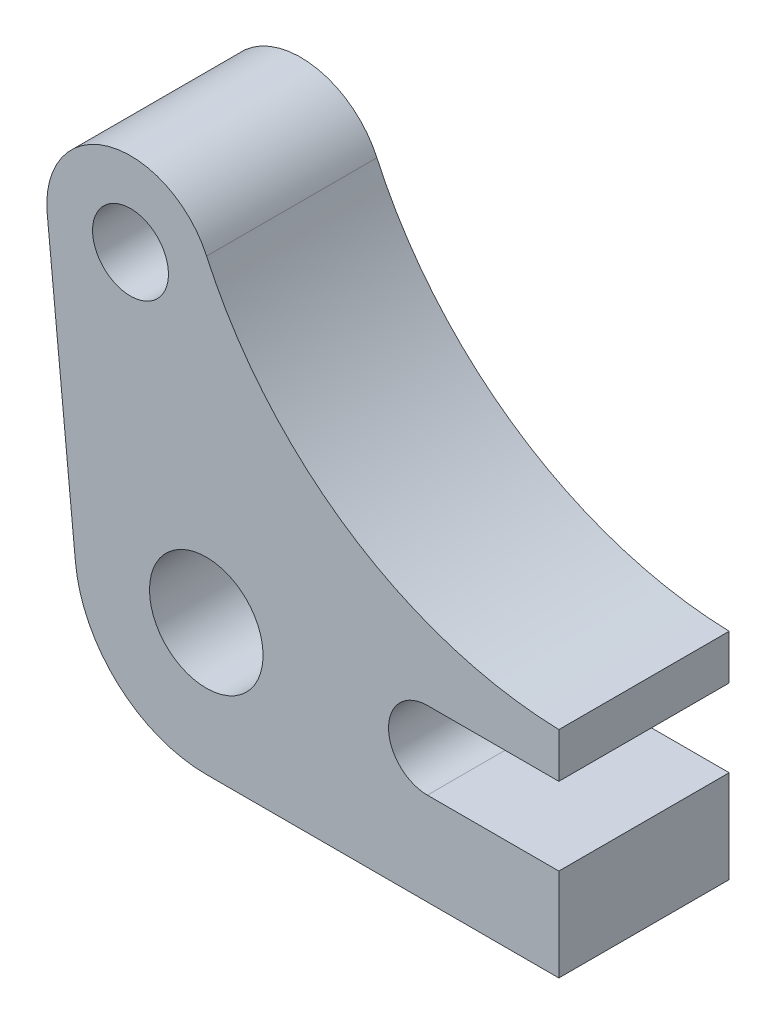
ISO-10303-21;
HEADER;
FILE_DESCRIPTION(('STEP AP214'),'2;1');
FILE_NAME('part.step','',(''),(''),'','','');
FILE_SCHEMA(('AUTOMOTIVE_DESIGN { 1 0 10303 214 1 1 1 1 }'));
ENDSEC;
DATA;
#1=APPLICATION_CONTEXT('core data for automotive mechanical design processes');
#2=APPLICATION_PROTOCOL_DEFINITION('international standard','automotive_design',2000,#1);
#3=PRODUCT_CONTEXT('',#1,'mechanical');
#4=PRODUCT('Part','Part','',(#3));
#5=PRODUCT_RELATED_PRODUCT_CATEGORY('part','',(#4));
#6=PRODUCT_DEFINITION_FORMATION('','',#4);
#7=PRODUCT_DEFINITION_CONTEXT('part definition',#1,'design');
#8=PRODUCT_DEFINITION('design','',#6,#7);
#9=PRODUCT_DEFINITION_SHAPE('','',#8);
#10=(LENGTH_UNIT() NAMED_UNIT(*) SI_UNIT(.MILLI.,.METRE.));
#11=(NAMED_UNIT(*) PLANE_ANGLE_UNIT() SI_UNIT($,.RADIAN.));
#12=(NAMED_UNIT(*) SI_UNIT($,.STERADIAN.) SOLID_ANGLE_UNIT());
#13=UNCERTAINTY_MEASURE_WITH_UNIT(LENGTH_MEASURE(1.E-05),#10,'distance_accuracy_value','');
#14=(GEOMETRIC_REPRESENTATION_CONTEXT(3) GLOBAL_UNCERTAINTY_ASSIGNED_CONTEXT((#13)) GLOBAL_UNIT_ASSIGNED_CONTEXT((#10,
#11,#12)) REPRESENTATION_CONTEXT('',''));
#15=CARTESIAN_POINT('',(0.,0.,0.));
#16=DIRECTION('',(0.,0.,1.));
#17=DIRECTION('',(1.,0.,0.));
#18=AXIS2_PLACEMENT_3D('',#15,#16,#17);
#19=CARTESIAN_POINT('',(-32.1833709770097,-19.5334703523663,28.5));
#20=DIRECTION('',(0.,0.,-1.));
#21=DIRECTION('',(-1.,0.,0.));
#22=AXIS2_PLACEMENT_3D('',#19,#20,#21);
#23=CYLINDRICAL_SURFACE('',#22,22.);
#24=CARTESIAN_POINT('',(-32.1833709770097,-19.5334703523663,0.));
#25=DIRECTION('',(0.,0.,1.));
#26=DIRECTION('',(1.,0.,0.));
#27=AXIS2_PLACEMENT_3D('',#24,#25,#26);
#28=CIRCLE('',#27,22.);
#29=CARTESIAN_POINT('',(-32.1833709770097,-41.5334703523663,0.));
#30=VERTEX_POINT('',#29);
#31=CARTESIAN_POINT('',(-54.0782417455557,-21.6816402778313,0.));
#32=VERTEX_POINT('',#31);
#33=EDGE_CURVE('E163',#30,#32,#28,.F.);
#34=ORIENTED_EDGE('',*,*,#33,.F.);
#35=DIRECTION('',(0.,0.,-1.));
#36=VECTOR('',#35,1.);
#37=CARTESIAN_POINT('',(-32.1833709770097,-41.5334703523663,28.5));
#38=LINE('',#37,#36);
#39=CARTESIAN_POINT('',(-32.1833709770097,-41.5334703523663,28.5));
#40=VERTEX_POINT('',#39);
#41=EDGE_CURVE('E11',#40,#30,#38,.T.);
#42=ORIENTED_EDGE('',*,*,#41,.F.);
#43=CARTESIAN_POINT('',(-32.1833709770097,-19.5334703523663,28.5));
#44=DIRECTION('',(0.,0.,1.));
#45=DIRECTION('',(1.,0.,0.));
#46=AXIS2_PLACEMENT_3D('',#43,#44,#45);
#47=CIRCLE('',#46,22.);
#48=CARTESIAN_POINT('',(-54.0782417455557,-21.6816402778313,28.5));
#49=VERTEX_POINT('',#48);
#50=EDGE_CURVE('E203',#40,#49,#47,.F.);
#51=ORIENTED_EDGE('',*,*,#50,.T.);
#52=DIRECTION('',(0.,0.,-1.));
#53=VECTOR('',#52,1.);
#54=CARTESIAN_POINT('',(-54.0782417455557,-21.6816402778313,28.5));
#55=LINE('',#54,#53);
#56=EDGE_CURVE('E103',#49,#32,#55,.T.);
#57=ORIENTED_EDGE('',*,*,#56,.T.);
#58=EDGE_LOOP('',(#34,#42,#51,#57));
#59=FACE_BOUND('',#58,.T.);
#60=ADVANCED_FACE('F45',(#59),#23,.T.);
#61=CARTESIAN_POINT('',(0.,-41.5334703523663,28.5));
#62=DIRECTION('',(0.,-1.,0.));
#63=DIRECTION('',(0.,0.,-1.));
#64=AXIS2_PLACEMENT_3D('',#61,#62,#63);
#65=PLANE('',#64);
#66=DIRECTION('',(-1.,0.,0.));
#67=VECTOR('',#66,1.);
#68=CARTESIAN_POINT('',(0.,-41.5334703523663,0.));
#69=LINE('',#68,#67);
#70=CARTESIAN_POINT('',(26.8166290229903,-41.5334703523663,0.));
#71=VERTEX_POINT('',#70);
#72=EDGE_CURVE('E167',#71,#30,#69,.T.);
#73=ORIENTED_EDGE('',*,*,#72,.F.);
#74=DIRECTION('',(0.,0.,-1.));
#75=VECTOR('',#74,1.);
#76=CARTESIAN_POINT('',(26.8166290229903,-41.5334703523663,28.5));
#77=LINE('',#76,#75);
#78=CARTESIAN_POINT('',(26.8166290229903,-41.5334703523663,28.5));
#79=VERTEX_POINT('',#78);
#80=EDGE_CURVE('E54',#79,#71,#77,.T.);
#81=ORIENTED_EDGE('',*,*,#80,.F.);
#82=DIRECTION('',(-1.,0.,0.));
#83=VECTOR('',#82,1.);
#84=CARTESIAN_POINT('',(0.,-41.5334703523663,28.5));
#85=LINE('',#84,#83);
#86=EDGE_CURVE('E248',#79,#40,#85,.T.);
#87=ORIENTED_EDGE('',*,*,#86,.T.);
#88=ORIENTED_EDGE('',*,*,#41,.T.);
#89=EDGE_LOOP('',(#73,#81,#87,#88));
#90=FACE_BOUND('',#89,.T.);
#91=ADVANCED_FACE('F232',(#90),#65,.T.);
#92=CARTESIAN_POINT('',(26.8166290229903,0.,28.5));
#93=DIRECTION('',(1.,0.,0.));
#94=DIRECTION('',(0.,1.,0.));
#95=AXIS2_PLACEMENT_3D('',#92,#93,#94);
#96=PLANE('',#95);
#97=DIRECTION('',(0.,-1.,0.));
#98=VECTOR('',#97,1.);
#99=CARTESIAN_POINT('',(26.8166290229903,0.,0.));
#100=LINE('',#99,#98);
#101=CARTESIAN_POINT('',(26.8166290229903,-26.0334703523663,0.));
#102=VERTEX_POINT('',#101);
#103=EDGE_CURVE('E171',#102,#71,#100,.T.);
#104=ORIENTED_EDGE('',*,*,#103,.F.);
#105=DIRECTION('',(0.,0.,-1.));
#106=VECTOR('',#105,1.);
#107=CARTESIAN_POINT('',(26.8166290229903,-26.0334703523663,28.5));
#108=LINE('',#107,#106);
#109=CARTESIAN_POINT('',(26.8166290229903,-26.0334703523663,28.5));
#110=VERTEX_POINT('',#109);
#111=EDGE_CURVE('E219',#110,#102,#108,.T.);
#112=ORIENTED_EDGE('',*,*,#111,.F.);
#113=DIRECTION('',(0.,-1.,0.));
#114=VECTOR('',#113,1.);
#115=CARTESIAN_POINT('',(26.8166290229903,0.,28.5));
#116=LINE('',#115,#114);
#117=EDGE_CURVE('E228',#110,#79,#116,.T.);
#118=ORIENTED_EDGE('',*,*,#117,.T.);
#119=ORIENTED_EDGE('',*,*,#80,.T.);
#120=EDGE_LOOP('',(#104,#112,#118,#119));
#121=FACE_BOUND('',#120,.T.);
#122=ADVANCED_FACE('F226',(#121),#96,.T.);
#123=CARTESIAN_POINT('',(0.,-26.0334703523663,28.5));
#124=DIRECTION('',(0.,-1.,0.));
#125=DIRECTION('',(1.,0.,0.));
#126=AXIS2_PLACEMENT_3D('',#123,#124,#125);
#127=PLANE('',#126);
#128=DIRECTION('',(-1.,0.,0.));
#129=VECTOR('',#128,1.);
#130=CARTESIAN_POINT('',(0.,-26.0334703523663,0.));
#131=LINE('',#130,#129);
#132=CARTESIAN_POINT('',(4.81662902299029,-26.0334703523663,0.));
#133=VERTEX_POINT('',#132);
#134=EDGE_CURVE('E175',#102,#133,#131,.T.);
#135=ORIENTED_EDGE('',*,*,#134,.T.);
#136=DIRECTION('',(0.,0.,-1.));
#137=VECTOR('',#136,1.);
#138=CARTESIAN_POINT('',(4.81662902299029,-26.0334703523663,28.5));
#139=LINE('',#138,#137);
#140=CARTESIAN_POINT('',(4.81662902299029,-26.0334703523663,28.5));
#141=VERTEX_POINT('',#140);
#142=EDGE_CURVE('E216',#141,#133,#139,.T.);
#143=ORIENTED_EDGE('',*,*,#142,.F.);
#144=DIRECTION('',(-1.,0.,0.));
#145=VECTOR('',#144,1.);
#146=CARTESIAN_POINT('',(0.,-26.0334703523663,28.5));
#147=LINE('',#146,#145);
#148=EDGE_CURVE('E243',#110,#141,#147,.T.);
#149=ORIENTED_EDGE('',*,*,#148,.F.);
#150=ORIENTED_EDGE('',*,*,#111,.T.);
#151=EDGE_LOOP('',(#135,#143,#149,#150));
#152=FACE_BOUND('',#151,.T.);
#153=ADVANCED_FACE('F240',(#152),#127,.F.);
#154=CARTESIAN_POINT('',(4.81662902299029,-19.5334703523663,28.5));
#155=DIRECTION('',(0.,0.,-1.));
#156=DIRECTION('',(-1.,0.,0.));
#157=AXIS2_PLACEMENT_3D('',#154,#155,#156);
#158=CYLINDRICAL_SURFACE('',#157,6.5);
#159=CARTESIAN_POINT('',(4.81662902299029,-19.5334703523663,0.));
#160=DIRECTION('',(0.,0.,1.));
#161=DIRECTION('',(1.,0.,0.));
#162=AXIS2_PLACEMENT_3D('',#159,#160,#161);
#163=CIRCLE('',#162,6.5);
#164=CARTESIAN_POINT('',(4.81662902299029,-13.0334703523663,0.));
#165=VERTEX_POINT('',#164);
#166=EDGE_CURVE('E180',#165,#133,#163,.T.);
#167=ORIENTED_EDGE('',*,*,#166,.F.);
#168=DIRECTION('',(0.,0.,-1.));
#169=VECTOR('',#168,1.);
#170=CARTESIAN_POINT('',(4.81662902299029,-13.0334703523663,28.5));
#171=LINE('',#170,#169);
#172=CARTESIAN_POINT('',(4.81662902299029,-13.0334703523663,28.5));
#173=VERTEX_POINT('',#172);
#174=EDGE_CURVE('E213',#173,#165,#171,.T.);
#175=ORIENTED_EDGE('',*,*,#174,.F.);
#176=CARTESIAN_POINT('',(4.81662902299029,-19.5334703523663,28.5));
#177=DIRECTION('',(0.,0.,1.));
#178=DIRECTION('',(1.,0.,0.));
#179=AXIS2_PLACEMENT_3D('',#176,#177,#178);
#180=CIRCLE('',#179,6.5);
#181=EDGE_CURVE('E246',#173,#141,#180,.T.);
#182=ORIENTED_EDGE('',*,*,#181,.T.);
#183=ORIENTED_EDGE('',*,*,#142,.T.);
#184=EDGE_LOOP('',(#167,#175,#182,#183));
#185=FACE_BOUND('',#184,.T.);
#186=ADVANCED_FACE('F262',(#185),#158,.F.);
#187=CARTESIAN_POINT('',(0.,-13.0334703523663,28.5));
#188=DIRECTION('',(0.,-1.,0.));
#189=DIRECTION('',(1.,0.,0.));
#190=AXIS2_PLACEMENT_3D('',#187,#188,#189);
#191=PLANE('',#190);
#192=DIRECTION('',(-1.,0.,0.));
#193=VECTOR('',#192,1.);
#194=CARTESIAN_POINT('',(0.,-13.0334703523663,0.));
#195=LINE('',#194,#193);
#196=CARTESIAN_POINT('',(26.8166290229903,-13.0334703523663,0.));
#197=VERTEX_POINT('',#196);
#198=EDGE_CURVE('E184',#197,#165,#195,.T.);
#199=ORIENTED_EDGE('',*,*,#198,.F.);
#200=DIRECTION('',(0.,0.,-1.));
#201=VECTOR('',#200,1.);
#202=CARTESIAN_POINT('',(26.8166290229903,-13.0334703523663,28.5));
#203=LINE('',#202,#201);
#204=CARTESIAN_POINT('',(26.8166290229903,-13.0334703523663,28.5));
#205=VERTEX_POINT('',#204);
#206=EDGE_CURVE('E210',#205,#197,#203,.T.);
#207=ORIENTED_EDGE('',*,*,#206,.F.);
#208=DIRECTION('',(-1.,0.,0.));
#209=VECTOR('',#208,1.);
#210=CARTESIAN_POINT('',(0.,-13.0334703523663,28.5));
#211=LINE('',#210,#209);
#212=EDGE_CURVE('E254',#205,#173,#211,.T.);
#213=ORIENTED_EDGE('',*,*,#212,.T.);
#214=ORIENTED_EDGE('',*,*,#174,.T.);
#215=EDGE_LOOP('',(#199,#207,#213,#214));
#216=FACE_BOUND('',#215,.T.);
#217=ADVANCED_FACE('F264',(#216),#191,.T.);
#218=CARTESIAN_POINT('',(26.8166290229903,-5.53347035236634,0.));
#219=VERTEX_POINT('',#218);
#220=EDGE_CURVE('E176',#219,#197,#100,.T.);
#221=ORIENTED_EDGE('',*,*,#220,.F.);
#222=DIRECTION('',(0.,0.,-1.));
#223=VECTOR('',#222,1.);
#224=CARTESIAN_POINT('',(26.8166290229903,-5.53347035236634,28.5));
#225=LINE('',#224,#223);
#226=CARTESIAN_POINT('',(26.8166290229903,-5.53347035236634,28.5));
#227=VERTEX_POINT('',#226);
#228=EDGE_CURVE('E145',#227,#219,#225,.T.);
#229=ORIENTED_EDGE('',*,*,#228,.F.);
#230=EDGE_CURVE('E136',#227,#205,#116,.T.);
#231=ORIENTED_EDGE('',*,*,#230,.T.);
#232=ORIENTED_EDGE('',*,*,#206,.T.);
#233=EDGE_LOOP('',(#221,#229,#231,#232));
#234=FACE_BOUND('',#233,.T.);
#235=ADVANCED_FACE('F278',(#234),#96,.T.);
#236=CARTESIAN_POINT('',(28.8187523700846,61.4366088032015,28.5));
#237=DIRECTION('',(0.,0.,-1.));
#238=DIRECTION('',(-1.,0.,0.));
#239=AXIS2_PLACEMENT_3D('',#236,#237,#238);
#240=CYLINDRICAL_SURFACE('',#239,67.);
#241=CARTESIAN_POINT('',(28.8187523700846,61.4366088032015,0.));
#242=DIRECTION('',(0.,0.,1.));
#243=DIRECTION('',(1.,0.,0.));
#244=AXIS2_PLACEMENT_3D('',#241,#242,#243);
#245=CIRCLE('',#244,67.);
#246=CARTESIAN_POINT('',(-32.1299536709879,33.6111666338678,0.));
#247=VERTEX_POINT('',#246);
#248=EDGE_CURVE('E143',#219,#247,#245,.F.);
#249=ORIENTED_EDGE('',*,*,#248,.T.);
#250=DIRECTION('',(0.,0.,-1.));
#251=VECTOR('',#250,1.);
#252=CARTESIAN_POINT('',(-32.1299536709879,33.6111666338678,28.5));
#253=LINE('',#252,#251);
#254=CARTESIAN_POINT('',(-32.1299536709879,33.6111666338678,28.5));
#255=VERTEX_POINT('',#254);
#256=EDGE_CURVE('E140',#255,#247,#253,.T.);
#257=ORIENTED_EDGE('',*,*,#256,.F.);
#258=CARTESIAN_POINT('',(28.8187523700846,61.4366088032015,28.5));
#259=DIRECTION('',(0.,0.,1.));
#260=DIRECTION('',(1.,0.,0.));
#261=AXIS2_PLACEMENT_3D('',#258,#259,#260);
#262=CIRCLE('',#261,67.);
#263=EDGE_CURVE('E128',#227,#255,#262,.F.);
#264=ORIENTED_EDGE('',*,*,#263,.F.);
#265=ORIENTED_EDGE('',*,*,#228,.T.);
#266=EDGE_LOOP('',(#249,#257,#264,#265));
#267=FACE_BOUND('',#266,.T.);
#268=ADVANCED_FACE('F141',(#267),#240,.F.);
#269=CARTESIAN_POINT('',(-44.8655041870329,27.7968951357981,28.5));
#270=DIRECTION('',(0.,0.,-1.));
#271=DIRECTION('',(-1.,0.,0.));
#272=AXIS2_PLACEMENT_3D('',#269,#270,#271);
#273=CYLINDRICAL_SURFACE('',#272,14.);
#274=CARTESIAN_POINT('',(-44.8655041870329,27.7968951357981,0.));
#275=DIRECTION('',(0.,0.,1.));
#276=DIRECTION('',(1.,0.,0.));
#277=AXIS2_PLACEMENT_3D('',#274,#275,#276);
#278=CIRCLE('',#277,14.);
#279=CARTESIAN_POINT('',(-58.7986037670167,26.4298779105022,0.));
#280=VERTEX_POINT('',#279);
#281=EDGE_CURVE('E96',#247,#280,#278,.T.);
#282=ORIENTED_EDGE('',*,*,#281,.T.);
#283=DIRECTION('',(0.,0.,-1.));
#284=VECTOR('',#283,1.);
#285=CARTESIAN_POINT('',(-58.7986037670167,26.4298779105022,28.5));
#286=LINE('',#285,#284);
#287=CARTESIAN_POINT('',(-58.7986037670167,26.4298779105022,28.5));
#288=VERTEX_POINT('',#287);
#289=EDGE_CURVE('E146',#288,#280,#286,.T.);
#290=ORIENTED_EDGE('',*,*,#289,.F.);
#291=CARTESIAN_POINT('',(-44.8655041870329,27.7968951357981,28.5));
#292=DIRECTION('',(0.,0.,1.));
#293=DIRECTION('',(1.,0.,0.));
#294=AXIS2_PLACEMENT_3D('',#291,#292,#293);
#295=CIRCLE('',#294,14.);
#296=EDGE_CURVE('E133',#255,#288,#295,.T.);
#297=ORIENTED_EDGE('',*,*,#296,.F.);
#298=ORIENTED_EDGE('',*,*,#256,.T.);
#299=EDGE_LOOP('',(#282,#290,#297,#298));
#300=FACE_BOUND('',#299,.T.);
#301=ADVANCED_FACE('F148',(#300),#273,.T.);
#302=CARTESIAN_POINT('',(-32.1833709770097,-19.5334703523663,28.5));
#303=DIRECTION('',(0.,0.,-1.));
#304=DIRECTION('',(-1.,0.,0.));
#305=AXIS2_PLACEMENT_3D('',#302,#303,#304);
#306=CYLINDRICAL_SURFACE('',#305,9.5);
#307=CARTESIAN_POINT('',(-32.1833709770097,-19.5334703523663,28.5));
#308=DIRECTION('',(0.,0.,1.));
#309=DIRECTION('',(1.,0.,0.));
#310=AXIS2_PLACEMENT_3D('',#307,#308,#309);
#311=CIRCLE('',#310,9.5);
#312=CARTESIAN_POINT('',(-41.6833709770097,-19.5334703523663,28.5));
#313=VERTEX_POINT('',#312);
#314=EDGE_CURVE('E152',#313,#313,#311,.T.);
#315=CARTESIAN_POINT('',(-32.1833709770097,-19.5334703523663,0.));
#316=DIRECTION('',(0.,0.,1.));
#317=DIRECTION('',(1.,0.,0.));
#318=AXIS2_PLACEMENT_3D('',#315,#316,#317);
#319=CIRCLE('',#318,9.5);
#320=CARTESIAN_POINT('',(-41.6833709770097,-19.5334703523663,0.));
#321=VERTEX_POINT('',#320);
#322=EDGE_CURVE('E195',#321,#321,#319,.T.);
#323=CARTESIAN_POINT('',(-41.6833709770097,-19.5334703523663,28.5));
#324=CARTESIAN_POINT('',(-41.6833709770097,-19.5334703523663,28.203125));
#325=CARTESIAN_POINT('',(-41.6833709770097,-19.5334703523663,27.90625));
#326=CARTESIAN_POINT('',(-41.6833709770097,-19.5334703523663,27.3125));
#327=CARTESIAN_POINT('',(-41.6833709770097,-19.5334703523663,27.015625));
#328=CARTESIAN_POINT('',(-41.6833709770097,-19.5334703523663,26.421875));
#329=CARTESIAN_POINT('',(-41.6833709770097,-19.5334703523663,26.125));
#330=CARTESIAN_POINT('',(-41.6833709770097,-19.5334703523663,25.53125));
#331=CARTESIAN_POINT('',(-41.6833709770097,-19.5334703523663,25.234375));
#332=CARTESIAN_POINT('',(-41.6833709770097,-19.5334703523663,24.640625));
#333=CARTESIAN_POINT('',(-41.6833709770097,-19.5334703523663,24.34375));
#334=CARTESIAN_POINT('',(-41.6833709770097,-19.5334703523663,23.75));
#335=CARTESIAN_POINT('',(-41.6833709770097,-19.5334703523663,23.453125));
#336=CARTESIAN_POINT('',(-41.6833709770097,-19.5334703523663,22.859375));
#337=CARTESIAN_POINT('',(-41.6833709770097,-19.5334703523663,22.5625));
#338=CARTESIAN_POINT('',(-41.6833709770097,-19.5334703523663,21.96875));
#339=CARTESIAN_POINT('',(-41.6833709770097,-19.5334703523663,21.671875));
#340=CARTESIAN_POINT('',(-41.6833709770097,-19.5334703523663,21.078125));
#341=CARTESIAN_POINT('',(-41.6833709770097,-19.5334703523663,20.78125));
#342=CARTESIAN_POINT('',(-41.6833709770097,-19.5334703523663,20.1875));
#343=CARTESIAN_POINT('',(-41.6833709770097,-19.5334703523663,19.890625));
#344=CARTESIAN_POINT('',(-41.6833709770097,-19.5334703523663,19.296875));
#345=CARTESIAN_POINT('',(-41.6833709770097,-19.5334703523663,19.));
#346=CARTESIAN_POINT('',(-41.6833709770097,-19.5334703523663,18.40625));
#347=CARTESIAN_POINT('',(-41.6833709770097,-19.5334703523663,18.109375));
#348=CARTESIAN_POINT('',(-41.6833709770097,-19.5334703523663,17.515625));
#349=CARTESIAN_POINT('',(-41.6833709770097,-19.5334703523663,17.21875));
#350=CARTESIAN_POINT('',(-41.6833709770097,-19.5334703523663,16.625));
#351=CARTESIAN_POINT('',(-41.6833709770097,-19.5334703523663,16.328125));
#352=CARTESIAN_POINT('',(-41.6833709770097,-19.5334703523663,15.734375));
#353=CARTESIAN_POINT('',(-41.6833709770097,-19.5334703523663,15.4375));
#354=CARTESIAN_POINT('',(-41.6833709770097,-19.5334703523663,14.84375));
#355=CARTESIAN_POINT('',(-41.6833709770097,-19.5334703523663,14.546875));
#356=CARTESIAN_POINT('',(-41.6833709770097,-19.5334703523663,13.953125));
#357=CARTESIAN_POINT('',(-41.6833709770097,-19.5334703523663,13.65625));
#358=CARTESIAN_POINT('',(-41.6833709770097,-19.5334703523663,13.0625));
#359=CARTESIAN_POINT('',(-41.6833709770097,-19.5334703523663,12.765625));
#360=CARTESIAN_POINT('',(-41.6833709770097,-19.5334703523663,12.171875));
#361=CARTESIAN_POINT('',(-41.6833709770097,-19.5334703523663,11.875));
#362=CARTESIAN_POINT('',(-41.6833709770097,-19.5334703523663,11.28125));
#363=CARTESIAN_POINT('',(-41.6833709770097,-19.5334703523663,10.984375));
#364=CARTESIAN_POINT('',(-41.6833709770097,-19.5334703523663,10.390625));
#365=CARTESIAN_POINT('',(-41.6833709770097,-19.5334703523663,10.09375));
#366=CARTESIAN_POINT('',(-41.6833709770097,-19.5334703523663,9.5));
#367=CARTESIAN_POINT('',(-41.6833709770097,-19.5334703523663,9.203125));
#368=CARTESIAN_POINT('',(-41.6833709770097,-19.5334703523663,8.609375));
#369=CARTESIAN_POINT('',(-41.6833709770097,-19.5334703523663,8.3125));
#370=CARTESIAN_POINT('',(-41.6833709770097,-19.5334703523663,7.71875));
#371=CARTESIAN_POINT('',(-41.6833709770097,-19.5334703523663,7.421875));
#372=CARTESIAN_POINT('',(-41.6833709770097,-19.5334703523663,6.828125));
#373=CARTESIAN_POINT('',(-41.6833709770097,-19.5334703523663,6.53125));
#374=CARTESIAN_POINT('',(-41.6833709770097,-19.5334703523663,5.9375));
#375=CARTESIAN_POINT('',(-41.6833709770097,-19.5334703523663,5.640625));
#376=CARTESIAN_POINT('',(-41.6833709770097,-19.5334703523663,5.046875));
#377=CARTESIAN_POINT('',(-41.6833709770097,-19.5334703523663,4.75));
#378=CARTESIAN_POINT('',(-41.6833709770097,-19.5334703523663,4.15625));
#379=CARTESIAN_POINT('',(-41.6833709770097,-19.5334703523663,3.859375));
#380=CARTESIAN_POINT('',(-41.6833709770097,-19.5334703523663,3.265625));
#381=CARTESIAN_POINT('',(-41.6833709770097,-19.5334703523663,2.96875));
#382=CARTESIAN_POINT('',(-41.6833709770097,-19.5334703523663,2.375));
#383=CARTESIAN_POINT('',(-41.6833709770097,-19.5334703523663,2.078125));
#384=CARTESIAN_POINT('',(-41.6833709770097,-19.5334703523663,1.484375));
#385=CARTESIAN_POINT('',(-41.6833709770097,-19.5334703523663,1.1875));
#386=CARTESIAN_POINT('',(-41.6833709770097,-19.5334703523663,0.593749999999999));
#387=CARTESIAN_POINT('',(-41.6833709770097,-19.5334703523663,0.296875));
#388=CARTESIAN_POINT('',(-41.6833709770097,-19.5334703523663,0.));
#389=B_SPLINE_CURVE_WITH_KNOTS('',3,(#323,#324,#325,#326,#327,#328,#329,#330,#331,#332,#333,
#334,#335,#336,#337,#338,#339,#340,#341,#342,#343,#344,#345,#346,#347,#348,#349,#350,#351,#352,
#353,#354,#355,#356,#357,#358,#359,#360,#361,#362,#363,#364,#365,#366,#367,#368,#369,#370,#371,
#372,#373,#374,#375,#376,#377,#378,#379,#380,#381,#382,#383,#384,#385,#386,#387,#388),
.UNSPECIFIED.,.F.,.F.,(4,2,2,2,2,2,2,2,2,2,2,2,2,2,2,2,2,2,2,2,2,2,2,2,2,2,2,2,2,2,2,2,4),(0.,
0.890625000000003,1.78125,2.671875,3.5625,4.453125,5.34375,6.234375,7.125,8.015625,8.90625,
9.796875,10.6875,11.578125,12.46875,13.359375,14.25,15.140625,16.03125,16.921875,17.8125,
18.703125,19.59375,20.484375,21.375,22.265625,23.15625,24.046875,24.9375,25.828125,26.71875,
27.609375,28.5),.UNSPECIFIED.);
#390=EDGE_CURVE('BSEAM291',#313,#321,#389,.T.);
#391=ORIENTED_EDGE('',*,*,#314,.T.);
#392=ORIENTED_EDGE('',*,*,#322,.F.);
#393=ORIENTED_EDGE('',*,*,#390,.T.);
#394=ORIENTED_EDGE('',*,*,#390,.F.);
#395=EDGE_LOOP('',(#391,#393,#392,#394));
#396=FACE_BOUND('',#395,.T.);
#397=ADVANCED_FACE('F291',(#396),#306,.F.);
#398=CARTESIAN_POINT('',(-55.6696071776234,-5.46190827822656,28.5));
#399=DIRECTION('',(0.99522139857027,0.097644087521137,0.));
#400=DIRECTION('',(-0.097644087521137,0.99522139857027,0.));
#401=AXIS2_PLACEMENT_3D('',#398,#399,#400);
#402=PLANE('',#401);
#403=DIRECTION('',(0.097644087521137,-0.99522139857027,0.));
#404=VECTOR('',#403,1.);
#405=CARTESIAN_POINT('',(-55.6696071776234,-5.46190827822656,0.));
#406=LINE('',#405,#404);
#407=EDGE_CURVE('E192',#280,#32,#406,.T.);
#408=ORIENTED_EDGE('',*,*,#407,.T.);
#409=ORIENTED_EDGE('',*,*,#56,.F.);
#410=DIRECTION('',(0.097644087521137,-0.99522139857027,0.));
#411=VECTOR('',#410,1.);
#412=CARTESIAN_POINT('',(-55.6696071776234,-5.46190827822656,28.5));
#413=LINE('',#412,#411);
#414=EDGE_CURVE('E62',#288,#49,#413,.T.);
#415=ORIENTED_EDGE('',*,*,#414,.F.);
#416=ORIENTED_EDGE('',*,*,#289,.T.);
#417=EDGE_LOOP('',(#408,#409,#415,#416));
#418=FACE_BOUND('',#417,.T.);
#419=ADVANCED_FACE('F292',(#418),#402,.F.);
#420=CARTESIAN_POINT('',(-44.8655041870329,27.7968951357981,28.5));
#421=DIRECTION('',(0.,0.,-1.));
#422=DIRECTION('',(-1.,0.,0.));
#423=AXIS2_PLACEMENT_3D('',#420,#421,#422);
#424=CYLINDRICAL_SURFACE('',#423,6.35);
#425=CARTESIAN_POINT('',(-44.8655041870329,27.7968951357981,28.5));
#426=DIRECTION('',(0.,0.,1.));
#427=DIRECTION('',(1.,0.,0.));
#428=AXIS2_PLACEMENT_3D('',#425,#426,#427);
#429=CIRCLE('',#428,6.35);
#430=CARTESIAN_POINT('',(-51.2155041870329,27.7968951357981,28.5));
#431=VERTEX_POINT('',#430);
#432=EDGE_CURVE('E159',#431,#431,#429,.T.);
#433=CARTESIAN_POINT('',(-44.8655041870329,27.7968951357981,0.));
#434=DIRECTION('',(0.,0.,1.));
#435=DIRECTION('',(1.,0.,0.));
#436=AXIS2_PLACEMENT_3D('',#433,#434,#435);
#437=CIRCLE('',#436,6.35);
#438=CARTESIAN_POINT('',(-51.2155041870329,27.7968951357981,0.));
#439=VERTEX_POINT('',#438);
#440=EDGE_CURVE('E199',#439,#439,#437,.T.);
#441=CARTESIAN_POINT('',(-51.2155041870329,27.7968951357981,28.5));
#442=CARTESIAN_POINT('',(-51.2155041870329,27.7968951357981,28.203125));
#443=CARTESIAN_POINT('',(-51.2155041870329,27.7968951357981,27.90625));
#444=CARTESIAN_POINT('',(-51.2155041870329,27.7968951357981,27.3125));
#445=CARTESIAN_POINT('',(-51.2155041870329,27.7968951357981,27.015625));
#446=CARTESIAN_POINT('',(-51.2155041870329,27.7968951357981,26.421875));
#447=CARTESIAN_POINT('',(-51.2155041870329,27.7968951357981,26.125));
#448=CARTESIAN_POINT('',(-51.2155041870329,27.7968951357981,25.53125));
#449=CARTESIAN_POINT('',(-51.2155041870329,27.7968951357981,25.234375));
#450=CARTESIAN_POINT('',(-51.2155041870329,27.7968951357981,24.640625));
#451=CARTESIAN_POINT('',(-51.2155041870329,27.7968951357981,24.34375));
#452=CARTESIAN_POINT('',(-51.2155041870329,27.7968951357981,23.75));
#453=CARTESIAN_POINT('',(-51.2155041870329,27.7968951357981,23.453125));
#454=CARTESIAN_POINT('',(-51.2155041870329,27.7968951357981,22.859375));
#455=CARTESIAN_POINT('',(-51.2155041870329,27.7968951357981,22.5625));
#456=CARTESIAN_POINT('',(-51.2155041870329,27.7968951357981,21.96875));
#457=CARTESIAN_POINT('',(-51.2155041870329,27.7968951357981,21.671875));
#458=CARTESIAN_POINT('',(-51.2155041870329,27.7968951357981,21.078125));
#459=CARTESIAN_POINT('',(-51.2155041870329,27.7968951357981,20.78125));
#460=CARTESIAN_POINT('',(-51.2155041870329,27.7968951357981,20.1875));
#461=CARTESIAN_POINT('',(-51.2155041870329,27.7968951357981,19.890625));
#462=CARTESIAN_POINT('',(-51.2155041870329,27.7968951357981,19.296875));
#463=CARTESIAN_POINT('',(-51.2155041870329,27.7968951357981,19.));
#464=CARTESIAN_POINT('',(-51.2155041870329,27.7968951357981,18.40625));
#465=CARTESIAN_POINT('',(-51.2155041870329,27.7968951357981,18.109375));
#466=CARTESIAN_POINT('',(-51.2155041870329,27.7968951357981,17.515625));
#467=CARTESIAN_POINT('',(-51.2155041870329,27.7968951357981,17.21875));
#468=CARTESIAN_POINT('',(-51.2155041870329,27.7968951357981,16.625));
#469=CARTESIAN_POINT('',(-51.2155041870329,27.7968951357981,16.328125));
#470=CARTESIAN_POINT('',(-51.2155041870329,27.7968951357981,15.734375));
#471=CARTESIAN_POINT('',(-51.2155041870329,27.7968951357981,15.4375));
#472=CARTESIAN_POINT('',(-51.2155041870329,27.7968951357981,14.84375));
#473=CARTESIAN_POINT('',(-51.2155041870329,27.7968951357981,14.546875));
#474=CARTESIAN_POINT('',(-51.2155041870329,27.7968951357981,13.953125));
#475=CARTESIAN_POINT('',(-51.2155041870329,27.7968951357981,13.65625));
#476=CARTESIAN_POINT('',(-51.2155041870329,27.7968951357981,13.0625));
#477=CARTESIAN_POINT('',(-51.2155041870329,27.7968951357981,12.765625));
#478=CARTESIAN_POINT('',(-51.2155041870329,27.7968951357981,12.171875));
#479=CARTESIAN_POINT('',(-51.2155041870329,27.7968951357981,11.875));
#480=CARTESIAN_POINT('',(-51.2155041870329,27.7968951357981,11.28125));
#481=CARTESIAN_POINT('',(-51.2155041870329,27.7968951357981,10.984375));
#482=CARTESIAN_POINT('',(-51.2155041870329,27.7968951357981,10.390625));
#483=CARTESIAN_POINT('',(-51.2155041870329,27.7968951357981,10.09375));
#484=CARTESIAN_POINT('',(-51.2155041870329,27.7968951357981,9.5));
#485=CARTESIAN_POINT('',(-51.2155041870329,27.7968951357981,9.203125));
#486=CARTESIAN_POINT('',(-51.2155041870329,27.7968951357981,8.609375));
#487=CARTESIAN_POINT('',(-51.2155041870329,27.7968951357981,8.3125));
#488=CARTESIAN_POINT('',(-51.2155041870329,27.7968951357981,7.71875));
#489=CARTESIAN_POINT('',(-51.2155041870329,27.7968951357981,7.421875));
#490=CARTESIAN_POINT('',(-51.2155041870329,27.7968951357981,6.828125));
#491=CARTESIAN_POINT('',(-51.2155041870329,27.7968951357981,6.53125));
#492=CARTESIAN_POINT('',(-51.2155041870329,27.7968951357981,5.9375));
#493=CARTESIAN_POINT('',(-51.2155041870329,27.7968951357981,5.640625));
#494=CARTESIAN_POINT('',(-51.2155041870329,27.7968951357981,5.046875));
#495=CARTESIAN_POINT('',(-51.2155041870329,27.7968951357981,4.75));
#496=CARTESIAN_POINT('',(-51.2155041870329,27.7968951357981,4.15625));
#497=CARTESIAN_POINT('',(-51.2155041870329,27.7968951357981,3.859375));
#498=CARTESIAN_POINT('',(-51.2155041870329,27.7968951357981,3.265625));
#499=CARTESIAN_POINT('',(-51.2155041870329,27.7968951357981,2.96875));
#500=CARTESIAN_POINT('',(-51.2155041870329,27.7968951357981,2.375));
#501=CARTESIAN_POINT('',(-51.2155041870329,27.7968951357981,2.078125));
#502=CARTESIAN_POINT('',(-51.2155041870329,27.7968951357981,1.484375));
#503=CARTESIAN_POINT('',(-51.2155041870329,27.7968951357981,1.1875));
#504=CARTESIAN_POINT('',(-51.2155041870329,27.7968951357981,0.593749999999999));
#505=CARTESIAN_POINT('',(-51.2155041870329,27.7968951357981,0.296875));
#506=CARTESIAN_POINT('',(-51.2155041870329,27.7968951357981,0.));
#507=B_SPLINE_CURVE_WITH_KNOTS('',3,(#441,#442,#443,#444,#445,#446,#447,#448,#449,#450,#451,
#452,#453,#454,#455,#456,#457,#458,#459,#460,#461,#462,#463,#464,#465,#466,#467,#468,#469,#470,
#471,#472,#473,#474,#475,#476,#477,#478,#479,#480,#481,#482,#483,#484,#485,#486,#487,#488,#489,
#490,#491,#492,#493,#494,#495,#496,#497,#498,#499,#500,#501,#502,#503,#504,#505,#506),
.UNSPECIFIED.,.F.,.F.,(4,2,2,2,2,2,2,2,2,2,2,2,2,2,2,2,2,2,2,2,2,2,2,2,2,2,2,2,2,2,2,2,4),(0.,
0.890624999999999,1.78125,2.671875,3.5625,4.453125,5.34375,6.234375,7.125,8.015625,8.90625,
9.796875,10.6875,11.578125,12.46875,13.359375,14.25,15.140625,16.03125,16.921875,17.8125,
18.703125,19.59375,20.484375,21.375,22.265625,23.15625,24.046875,24.9375,25.828125,26.71875,
27.609375,28.5),.UNSPECIFIED.);
#508=EDGE_CURVE('BSEAM295',#431,#439,#507,.T.);
#509=ORIENTED_EDGE('',*,*,#432,.T.);
#510=ORIENTED_EDGE('',*,*,#440,.F.);
#511=ORIENTED_EDGE('',*,*,#508,.T.);
#512=ORIENTED_EDGE('',*,*,#508,.F.);
#513=EDGE_LOOP('',(#509,#511,#510,#512));
#514=FACE_BOUND('',#513,.T.);
#515=ADVANCED_FACE('F295',(#514),#424,.F.);
#516=CARTESIAN_POINT('',(0.,0.,28.5));
#517=DIRECTION('',(0.,0.,1.));
#518=DIRECTION('',(1.,0.,0.));
#519=AXIS2_PLACEMENT_3D('',#516,#517,#518);
#520=PLANE('',#519);
#521=ORIENTED_EDGE('',*,*,#50,.F.);
#522=ORIENTED_EDGE('',*,*,#86,.F.);
#523=ORIENTED_EDGE('',*,*,#117,.F.);
#524=ORIENTED_EDGE('',*,*,#148,.T.);
#525=ORIENTED_EDGE('',*,*,#181,.F.);
#526=ORIENTED_EDGE('',*,*,#212,.F.);
#527=ORIENTED_EDGE('',*,*,#230,.F.);
#528=ORIENTED_EDGE('',*,*,#263,.T.);
#529=ORIENTED_EDGE('',*,*,#296,.T.);
#530=ORIENTED_EDGE('',*,*,#414,.T.);
#531=EDGE_LOOP('',(#521,#522,#523,#524,#525,#526,#527,#528,#529,#530));
#532=FACE_BOUND('',#531,.T.);
#533=ORIENTED_EDGE('',*,*,#314,.F.);
#534=EDGE_LOOP('',(#533));
#535=FACE_BOUND('',#534,.T.);
#536=ORIENTED_EDGE('',*,*,#432,.F.);
#537=EDGE_LOOP('',(#536));
#538=FACE_BOUND('',#537,.T.);
#539=ADVANCED_FACE('F130',(#532,#535,#538),#520,.T.);
#540=CARTESIAN_POINT('',(0.,0.,0.));
#541=DIRECTION('',(0.,0.,1.));
#542=DIRECTION('',(1.,0.,0.));
#543=AXIS2_PLACEMENT_3D('',#540,#541,#542);
#544=PLANE('',#543);
#545=ORIENTED_EDGE('',*,*,#33,.T.);
#546=ORIENTED_EDGE('',*,*,#407,.F.);
#547=ORIENTED_EDGE('',*,*,#281,.F.);
#548=ORIENTED_EDGE('',*,*,#248,.F.);
#549=ORIENTED_EDGE('',*,*,#220,.T.);
#550=ORIENTED_EDGE('',*,*,#198,.T.);
#551=ORIENTED_EDGE('',*,*,#166,.T.);
#552=ORIENTED_EDGE('',*,*,#134,.F.);
#553=ORIENTED_EDGE('',*,*,#103,.T.);
#554=ORIENTED_EDGE('',*,*,#72,.T.);
#555=EDGE_LOOP('',(#545,#546,#547,#548,#549,#550,#551,#552,#553,#554));
#556=FACE_BOUND('',#555,.T.);
#557=ORIENTED_EDGE('',*,*,#322,.T.);
#558=EDGE_LOOP('',(#557));
#559=FACE_BOUND('',#558,.T.);
#560=ORIENTED_EDGE('',*,*,#440,.T.);
#561=EDGE_LOOP('',(#560));
#562=FACE_BOUND('',#561,.T.);
#563=ADVANCED_FACE('F235',(#556,#559,#562),#544,.F.);
#564=CLOSED_SHELL('',(#60,#91,#122,#153,#186,#217,#235,#268,#301,#397,#419,#515,#539,#563));
#565=MANIFOLD_SOLID_BREP('B2',#564);
#566=ADVANCED_BREP_SHAPE_REPRESENTATION('',(#18,#565),#14);
#567=SHAPE_DEFINITION_REPRESENTATION(#9,#566);
ENDSEC;
END-ISO-10303-21;
